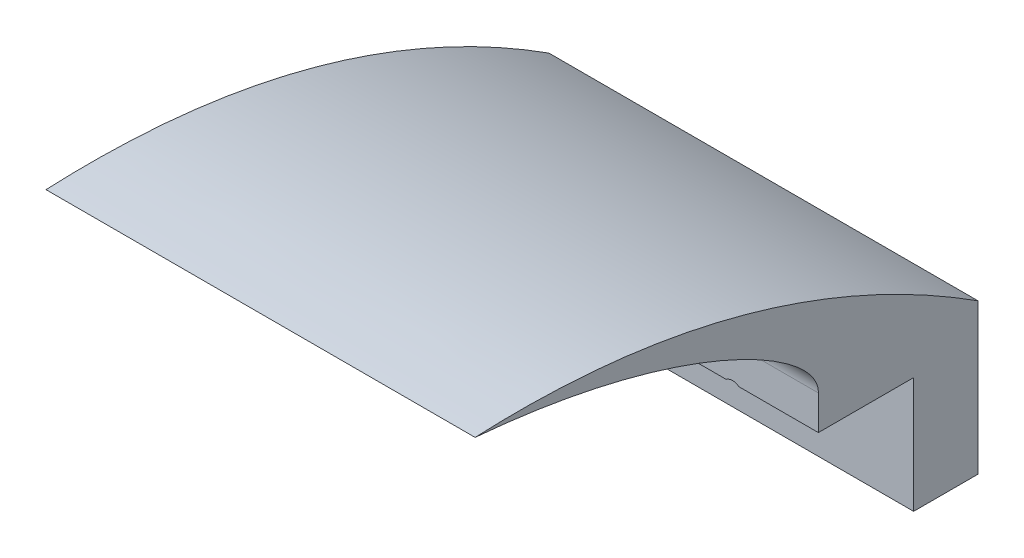
ISO-10303-21;
HEADER;
FILE_DESCRIPTION(('STEP AP214'),'2;1');
FILE_NAME('part.step','',(''),(''),'','','');
FILE_SCHEMA(('AUTOMOTIVE_DESIGN { 1 0 10303 214 1 1 1 1 }'));
ENDSEC;
DATA;
#1=APPLICATION_CONTEXT('core data for automotive mechanical design processes');
#2=APPLICATION_PROTOCOL_DEFINITION('international standard','automotive_design',2000,#1);
#3=PRODUCT_CONTEXT('',#1,'mechanical');
#4=PRODUCT('Part','Part','',(#3));
#5=PRODUCT_RELATED_PRODUCT_CATEGORY('part','',(#4));
#6=PRODUCT_DEFINITION_FORMATION('','',#4);
#7=PRODUCT_DEFINITION_CONTEXT('part definition',#1,'design');
#8=PRODUCT_DEFINITION('design','',#6,#7);
#9=PRODUCT_DEFINITION_SHAPE('','',#8);
#10=(LENGTH_UNIT() NAMED_UNIT(*) SI_UNIT(.MILLI.,.METRE.));
#11=(NAMED_UNIT(*) PLANE_ANGLE_UNIT() SI_UNIT($,.RADIAN.));
#12=(NAMED_UNIT(*) SI_UNIT($,.STERADIAN.) SOLID_ANGLE_UNIT());
#13=UNCERTAINTY_MEASURE_WITH_UNIT(LENGTH_MEASURE(1.E-05),#10,'distance_accuracy_value','');
#14=(GEOMETRIC_REPRESENTATION_CONTEXT(3) GLOBAL_UNCERTAINTY_ASSIGNED_CONTEXT((#13)) GLOBAL_UNIT_ASSIGNED_CONTEXT((#10,
#11,#12)) REPRESENTATION_CONTEXT('',''));
#15=CARTESIAN_POINT('',(0.,0.,0.));
#16=DIRECTION('',(0.,0.,1.));
#17=DIRECTION('',(1.,0.,0.));
#18=AXIS2_PLACEMENT_3D('',#15,#16,#17);
#19=CARTESIAN_POINT('',(63.5,-8.63247706217228,-29.003260664957));
#20=DIRECTION('',(0.,1.,0.));
#21=DIRECTION('',(0.,0.,1.));
#22=AXIS2_PLACEMENT_3D('',#19,#20,#21);
#23=PLANE('',#22);
#24=DIRECTION('',(-1.,0.,0.));
#25=VECTOR('',#24,1.);
#26=CARTESIAN_POINT('',(63.5,-8.63247706217228,-0.809260664956986));
#27=LINE('',#26,#25);
#28=CARTESIAN_POINT('',(63.5,-8.63247706217228,-0.809260664956986));
#29=VERTEX_POINT('',#28);
#30=CARTESIAN_POINT('',(40.005,-8.63247706217229,-0.809260664956984));
#31=VERTEX_POINT('',#30);
#32=EDGE_CURVE('E150',#29,#31,#27,.T.);
#33=ORIENTED_EDGE('',*,*,#32,.T.);
#34=DIRECTION('',(0.,0.,-1.));
#35=VECTOR('',#34,1.);
#36=CARTESIAN_POINT('',(40.005,-8.63247706217229,100.790739335043));
#37=LINE('',#36,#35);
#38=CARTESIAN_POINT('',(40.005,-8.63247706217228,-29.003260664957));
#39=VERTEX_POINT('',#38);
#40=EDGE_CURVE('E361',#31,#39,#37,.T.);
#41=ORIENTED_EDGE('',*,*,#40,.T.);
#42=DIRECTION('',(-1.,0.,0.));
#43=VECTOR('',#42,1.);
#44=CARTESIAN_POINT('',(63.5,-8.63247706217228,-29.003260664957));
#45=LINE('',#44,#43);
#46=CARTESIAN_POINT('',(63.5,-8.63247706217228,-29.003260664957));
#47=VERTEX_POINT('',#46);
#48=EDGE_CURVE('E142',#47,#39,#45,.T.);
#49=ORIENTED_EDGE('',*,*,#48,.F.);
#50=DIRECTION('',(0.,0.,-1.));
#51=VECTOR('',#50,1.);
#52=CARTESIAN_POINT('',(63.5,-8.63247706217228,-29.003260664957));
#53=LINE('',#52,#51);
#54=EDGE_CURVE('E367',#29,#47,#53,.T.);
#55=ORIENTED_EDGE('',*,*,#54,.F.);
#56=EDGE_LOOP('',(#33,#41,#49,#55));
#57=FACE_BOUND('',#56,.T.);
#58=ADVANCED_FACE('F37',(#57),#23,.F.);
#59=CARTESIAN_POINT('',(36.195,-8.63247706217228,-29.003260664957));
#60=VERTEX_POINT('',#59);
#61=CARTESIAN_POINT('',(-36.195,-8.63247706217228,-29.003260664957));
#62=VERTEX_POINT('',#61);
#63=EDGE_CURVE('E134',#60,#62,#45,.T.);
#64=ORIENTED_EDGE('',*,*,#63,.F.);
#65=DIRECTION('',(0.,0.,-1.));
#66=VECTOR('',#65,1.);
#67=CARTESIAN_POINT('',(36.195,-8.63247706217229,100.790739335043));
#68=LINE('',#67,#66);
#69=CARTESIAN_POINT('',(36.195,-8.63247706217229,-0.809260664956984));
#70=VERTEX_POINT('',#69);
#71=EDGE_CURVE('E63',#60,#70,#68,.F.);
#72=ORIENTED_EDGE('',*,*,#71,.T.);
#73=CARTESIAN_POINT('',(-36.195,-8.63247706217229,-0.809260664956984));
#74=VERTEX_POINT('',#73);
#75=EDGE_CURVE('E136',#70,#74,#27,.T.);
#76=ORIENTED_EDGE('',*,*,#75,.T.);
#77=DIRECTION('',(0.,0.,-1.));
#78=VECTOR('',#77,1.);
#79=CARTESIAN_POINT('',(-36.195,-8.63247706217229,100.790739335043));
#80=LINE('',#79,#78);
#81=EDGE_CURVE('E123',#74,#62,#80,.T.);
#82=ORIENTED_EDGE('',*,*,#81,.T.);
#83=EDGE_LOOP('',(#64,#72,#76,#82));
#84=FACE_BOUND('',#83,.T.);
#85=ADVANCED_FACE('F133',(#84),#23,.F.);
#86=CARTESIAN_POINT('',(63.5,1.52752293782772,-48.053260664957));
#87=CARTESIAN_POINT('',(63.5,44.7231521917692,19.4323343814543));
#88=CARTESIAN_POINT('',(63.5,40.9362455977717,100.790739335043));
#89=B_SPLINE_CURVE_WITH_KNOTS('',2,(#86,#87,#88),.UNSPECIFIED.,.F.,.F.,(3,3),(0.,1.),.UNSPECIFIED.);
#90=DIRECTION('',(-1.,0.,0.));
#91=VECTOR('',#90,1.);
#92=SURFACE_OF_LINEAR_EXTRUSION('',#89,#91);
#93=CARTESIAN_POINT('',(-63.5,1.52752293782772,-48.053260664957));
#94=CARTESIAN_POINT('',(-63.5,44.7231521917692,19.4323343814543));
#95=CARTESIAN_POINT('',(-63.5,40.9362455977717,100.790739335043));
#96=B_SPLINE_CURVE_WITH_KNOTS('',2,(#93,#94,#95),.UNSPECIFIED.,.F.,.F.,(3,3),(0.,1.),.UNSPECIFIED.);
#97=CARTESIAN_POINT('',(-63.5,1.52752293782772,-48.053260664957));
#98=VERTEX_POINT('',#97);
#99=CARTESIAN_POINT('',(-63.5,40.9362455977717,100.790739335043));
#100=VERTEX_POINT('',#99);
#101=EDGE_CURVE('E232',#98,#100,#96,.T.);
#102=ORIENTED_EDGE('',*,*,#101,.T.);
#103=DIRECTION('',(-1.,0.,0.));
#104=VECTOR('',#103,1.);
#105=CARTESIAN_POINT('',(63.5,40.9362455977717,100.790739335043));
#106=LINE('',#105,#104);
#107=CARTESIAN_POINT('',(63.5,40.9362455977717,100.790739335043));
#108=VERTEX_POINT('',#107);
#109=EDGE_CURVE('E11',#108,#100,#106,.T.);
#110=ORIENTED_EDGE('',*,*,#109,.F.);
#111=CARTESIAN_POINT('',(63.5,1.52752293782772,-48.053260664957));
#112=VERTEX_POINT('',#111);
#113=EDGE_CURVE('E215',#112,#108,#89,.T.);
#114=ORIENTED_EDGE('',*,*,#113,.F.);
#115=DIRECTION('',(-1.,0.,0.));
#116=VECTOR('',#115,1.);
#117=CARTESIAN_POINT('',(63.5,1.52752293782772,-48.053260664957));
#118=LINE('',#117,#116);
#119=EDGE_CURVE('E219',#112,#98,#118,.T.);
#120=ORIENTED_EDGE('',*,*,#119,.T.);
#121=EDGE_LOOP('',(#102,#110,#114,#120));
#122=FACE_BOUND('',#121,.T.);
#123=ADVANCED_FACE('F39',(#122),#92,.F.);
#124=CARTESIAN_POINT('',(63.5,40.9362455977717,100.790739335043));
#125=CARTESIAN_POINT('',(63.5,40.5065367150402,95.8120008174614));
#126=CARTESIAN_POINT('',(63.5,39.3560904800015,85.4040957347553));
#127=CARTESIAN_POINT('',(63.5,36.825372046816,70.0470492598012));
#128=CARTESIAN_POINT('',(63.5,33.4552343158838,55.2044579453297));
#129=CARTESIAN_POINT('',(63.5,29.540032244637,41.8486709281453));
#130=CARTESIAN_POINT('',(63.5,25.2554620985368,30.1358628630424));
#131=CARTESIAN_POINT('',(63.5,20.7750354323623,20.1921263411997));
#132=CARTESIAN_POINT('',(63.5,16.2715313893256,12.1116847802399));
#133=CARTESIAN_POINT('',(63.5,11.9042098812234,5.93047223723088));
#134=CARTESIAN_POINT('',(63.5,7.76806304427283,1.68165289659331));
#135=CARTESIAN_POINT('',(63.5,4.2871603037317,-0.491896356756057));
#136=CARTESIAN_POINT('',(63.5,2.16300200752415,-0.811759740084424));
#137=CARTESIAN_POINT('',(63.5,1.52752293782777,-0.809260664956984));
#138=B_SPLINE_CURVE_WITH_KNOTS('',3,(#124,#125,#126,#127,#128,#129,#130,#131,#132,#133,#134,
#135,#136,#137),.UNSPECIFIED.,.F.,.F.,(4,1,1,1,1,1,1,1,1,1,1,4),(0.353790810134737,
0.374279703233646,0.39671125377608,0.41757673414408,0.436654005915541,0.45374438973928,
0.468679993939526,0.481329415272233,0.491630702034347,0.499615788540128,0.50554628117804,
0.508115399218113),.UNSPECIFIED.);
#139=DIRECTION('',(-1.,0.,0.));
#140=VECTOR('',#139,1.);
#141=SURFACE_OF_LINEAR_EXTRUSION('',#138,#140);
#142=CARTESIAN_POINT('',(-63.5,40.9362455977717,100.790739335043));
#143=CARTESIAN_POINT('',(-63.5,40.5065367150402,95.8120008174614));
#144=CARTESIAN_POINT('',(-63.5,39.3560904800015,85.4040957347553));
#145=CARTESIAN_POINT('',(-63.5,36.825372046816,70.0470492598012));
#146=CARTESIAN_POINT('',(-63.5,33.4552343158838,55.2044579453297));
#147=CARTESIAN_POINT('',(-63.5,29.540032244637,41.8486709281453));
#148=CARTESIAN_POINT('',(-63.5,25.2554620985368,30.1358628630424));
#149=CARTESIAN_POINT('',(-63.5,20.7750354323623,20.1921263411997));
#150=CARTESIAN_POINT('',(-63.5,16.2715313893256,12.1116847802399));
#151=CARTESIAN_POINT('',(-63.5,11.9042098812234,5.93047223723088));
#152=CARTESIAN_POINT('',(-63.5,7.76806304427283,1.68165289659331));
#153=CARTESIAN_POINT('',(-63.5,4.2871603037317,-0.491896356756057));
#154=CARTESIAN_POINT('',(-63.5,2.16300200752415,-0.811759740084424));
#155=CARTESIAN_POINT('',(-63.5,1.52752293782777,-0.809260664956984));
#156=B_SPLINE_CURVE_WITH_KNOTS('',3,(#142,#143,#144,#145,#146,#147,#148,#149,#150,#151,#152,
#153,#154,#155),.UNSPECIFIED.,.F.,.F.,(4,1,1,1,1,1,1,1,1,1,1,4),(0.353790810134737,
0.374279703233646,0.39671125377608,0.41757673414408,0.436654005915541,0.45374438973928,
0.468679993939526,0.481329415272233,0.491630702034347,0.499615788540128,0.50554628117804,
0.508115399218113),.UNSPECIFIED.);
#157=CARTESIAN_POINT('',(-63.5,1.52752293782777,-0.809260664956984));
#158=VERTEX_POINT('',#157);
#159=EDGE_CURVE('E237',#100,#158,#156,.T.);
#160=ORIENTED_EDGE('',*,*,#159,.T.);
#161=DIRECTION('',(-1.,0.,0.));
#162=VECTOR('',#161,1.);
#163=CARTESIAN_POINT('',(63.5,1.52752293782777,-0.809260664956984));
#164=LINE('',#163,#162);
#165=CARTESIAN_POINT('',(63.5,1.52752293782777,-0.809260664956984));
#166=VERTEX_POINT('',#165);
#167=EDGE_CURVE('E47',#166,#158,#164,.T.);
#168=ORIENTED_EDGE('',*,*,#167,.F.);
#169=EDGE_CURVE('E255',#108,#166,#138,.T.);
#170=ORIENTED_EDGE('',*,*,#169,.F.);
#171=ORIENTED_EDGE('',*,*,#109,.T.);
#172=EDGE_LOOP('',(#160,#168,#170,#171));
#173=FACE_BOUND('',#172,.T.);
#174=ADVANCED_FACE('F191',(#173),#141,.F.);
#175=CARTESIAN_POINT('',(63.5,1.52752293782777,-0.809260664956984));
#176=DIRECTION('',(0.,0.,-1.));
#177=DIRECTION('',(0.,1.,0.));
#178=AXIS2_PLACEMENT_3D('',#175,#176,#177);
#179=PLANE('',#178);
#180=ORIENTED_EDGE('',*,*,#75,.F.);
#181=CARTESIAN_POINT('',(38.1,-11.1724770621723,-0.809260664956984));
#182=DIRECTION('',(0.,0.,-1.));
#183=DIRECTION('',(0.,1.,0.));
#184=AXIS2_PLACEMENT_3D('',#181,#182,#183);
#185=CIRCLE('',#184,3.175);
#186=EDGE_CURVE('E238',#70,#31,#185,.T.);
#187=ORIENTED_EDGE('',*,*,#186,.T.);
#188=ORIENTED_EDGE('',*,*,#32,.F.);
#189=DIRECTION('',(0.,-1.,0.));
#190=VECTOR('',#189,1.);
#191=CARTESIAN_POINT('',(63.5,1.52752293782777,-0.809260664956984));
#192=LINE('',#191,#190);
#193=EDGE_CURVE('E257',#166,#29,#192,.T.);
#194=ORIENTED_EDGE('',*,*,#193,.F.);
#195=ORIENTED_EDGE('',*,*,#167,.T.);
#196=DIRECTION('',(0.,-1.,0.));
#197=VECTOR('',#196,1.);
#198=CARTESIAN_POINT('',(-63.5,1.52752293782777,-0.809260664956984));
#199=LINE('',#198,#197);
#200=CARTESIAN_POINT('',(-63.5,-8.63247706217228,-0.809260664956986));
#201=VERTEX_POINT('',#200);
#202=EDGE_CURVE('E245',#158,#201,#199,.T.);
#203=ORIENTED_EDGE('',*,*,#202,.T.);
#204=CARTESIAN_POINT('',(-40.005,-8.63247706217229,-0.809260664956984));
#205=VERTEX_POINT('',#204);
#206=EDGE_CURVE('E145',#205,#201,#27,.T.);
#207=ORIENTED_EDGE('',*,*,#206,.F.);
#208=CARTESIAN_POINT('',(-38.1,-11.1724770621723,-0.809260664956984));
#209=DIRECTION('',(0.,0.,-1.));
#210=DIRECTION('',(0.,1.,0.));
#211=AXIS2_PLACEMENT_3D('',#208,#209,#210);
#212=CIRCLE('',#211,3.175);
#213=EDGE_CURVE('E137',#205,#74,#212,.T.);
#214=ORIENTED_EDGE('',*,*,#213,.T.);
#215=EDGE_LOOP('',(#180,#187,#188,#194,#195,#203,#207,#214));
#216=FACE_BOUND('',#215,.T.);
#217=ADVANCED_FACE('F184',(#216),#179,.F.);
#218=CARTESIAN_POINT('',(-40.005,-8.63247706217228,-29.003260664957));
#219=VERTEX_POINT('',#218);
#220=CARTESIAN_POINT('',(-63.5,-8.63247706217228,-29.003260664957));
#221=VERTEX_POINT('',#220);
#222=EDGE_CURVE('E143',#219,#221,#45,.T.);
#223=ORIENTED_EDGE('',*,*,#222,.F.);
#224=DIRECTION('',(0.,0.,-1.));
#225=VECTOR('',#224,1.);
#226=CARTESIAN_POINT('',(-40.005,-8.63247706217229,100.790739335043));
#227=LINE('',#226,#225);
#228=EDGE_CURVE('E55',#219,#205,#227,.F.);
#229=ORIENTED_EDGE('',*,*,#228,.T.);
#230=ORIENTED_EDGE('',*,*,#206,.T.);
#231=DIRECTION('',(0.,0.,-1.));
#232=VECTOR('',#231,1.);
#233=CARTESIAN_POINT('',(-63.5,-8.63247706217228,-29.003260664957));
#234=LINE('',#233,#232);
#235=EDGE_CURVE('E196',#201,#221,#234,.T.);
#236=ORIENTED_EDGE('',*,*,#235,.T.);
#237=EDGE_LOOP('',(#223,#229,#230,#236));
#238=FACE_BOUND('',#237,.T.);
#239=ADVANCED_FACE('F177',(#238),#23,.F.);
#240=CARTESIAN_POINT('',(63.5,-42.9224770621723,-29.003260664957));
#241=DIRECTION('',(0.,0.,-1.));
#242=DIRECTION('',(-1.,0.,0.));
#243=AXIS2_PLACEMENT_3D('',#240,#241,#242);
#244=PLANE('',#243);
#245=ORIENTED_EDGE('',*,*,#48,.T.);
#246=CARTESIAN_POINT('',(38.1,-11.1724770621723,-29.003260664957));
#247=DIRECTION('',(0.,0.,-1.));
#248=DIRECTION('',(-1.,0.,0.));
#249=AXIS2_PLACEMENT_3D('',#246,#247,#248);
#250=CIRCLE('',#249,3.175);
#251=EDGE_CURVE('E141',#39,#60,#250,.T.);
#252=ORIENTED_EDGE('',*,*,#251,.T.);
#253=ORIENTED_EDGE('',*,*,#63,.T.);
#254=CARTESIAN_POINT('',(-38.1,-11.1724770621723,-29.003260664957));
#255=DIRECTION('',(0.,0.,-1.));
#256=DIRECTION('',(-1.,0.,0.));
#257=AXIS2_PLACEMENT_3D('',#254,#255,#256);
#258=CIRCLE('',#257,3.175);
#259=EDGE_CURVE('E120',#62,#219,#258,.T.);
#260=ORIENTED_EDGE('',*,*,#259,.T.);
#261=ORIENTED_EDGE('',*,*,#222,.T.);
#262=DIRECTION('',(0.,-1.,0.));
#263=VECTOR('',#262,1.);
#264=CARTESIAN_POINT('',(-63.5,-42.9224770621723,-29.003260664957));
#265=LINE('',#264,#263);
#266=CARTESIAN_POINT('',(-63.5,-42.9224770621723,-29.003260664957));
#267=VERTEX_POINT('',#266);
#268=EDGE_CURVE('E199',#221,#267,#265,.T.);
#269=ORIENTED_EDGE('',*,*,#268,.T.);
#270=DIRECTION('',(-1.,0.,0.));
#271=VECTOR('',#270,1.);
#272=CARTESIAN_POINT('',(63.5,-42.9224770621723,-29.003260664957));
#273=LINE('',#272,#271);
#274=CARTESIAN_POINT('',(63.5,-42.9224770621723,-29.003260664957));
#275=VERTEX_POINT('',#274);
#276=EDGE_CURVE('E146',#275,#267,#273,.T.);
#277=ORIENTED_EDGE('',*,*,#276,.F.);
#278=DIRECTION('',(0.,-1.,0.));
#279=VECTOR('',#278,1.);
#280=CARTESIAN_POINT('',(63.5,-42.9224770621723,-29.003260664957));
#281=LINE('',#280,#279);
#282=EDGE_CURVE('E228',#47,#275,#281,.T.);
#283=ORIENTED_EDGE('',*,*,#282,.F.);
#284=EDGE_LOOP('',(#245,#252,#253,#260,#261,#269,#277,#283));
#285=FACE_BOUND('',#284,.T.);
#286=ADVANCED_FACE('F140',(#285),#244,.F.);
#287=CARTESIAN_POINT('',(63.5,-42.9224770621723,-48.053260664957));
#288=DIRECTION('',(0.,1.,0.));
#289=DIRECTION('',(0.,0.,1.));
#290=AXIS2_PLACEMENT_3D('',#287,#288,#289);
#291=PLANE('',#290);
#292=DIRECTION('',(0.,0.,-1.));
#293=VECTOR('',#292,1.);
#294=CARTESIAN_POINT('',(-63.5,-42.9224770621723,-48.053260664957));
#295=LINE('',#294,#293);
#296=CARTESIAN_POINT('',(-63.5,-42.9224770621723,-48.053260664957));
#297=VERTEX_POINT('',#296);
#298=EDGE_CURVE('E204',#267,#297,#295,.T.);
#299=ORIENTED_EDGE('',*,*,#298,.T.);
#300=DIRECTION('',(-1.,0.,0.));
#301=VECTOR('',#300,1.);
#302=CARTESIAN_POINT('',(63.5,-42.9224770621723,-48.053260664957));
#303=LINE('',#302,#301);
#304=CARTESIAN_POINT('',(63.5,-42.9224770621723,-48.053260664957));
#305=VERTEX_POINT('',#304);
#306=EDGE_CURVE('E210',#305,#297,#303,.T.);
#307=ORIENTED_EDGE('',*,*,#306,.F.);
#308=DIRECTION('',(0.,0.,-1.));
#309=VECTOR('',#308,1.);
#310=CARTESIAN_POINT('',(63.5,-42.9224770621723,-48.053260664957));
#311=LINE('',#310,#309);
#312=EDGE_CURVE('E209',#275,#305,#311,.T.);
#313=ORIENTED_EDGE('',*,*,#312,.F.);
#314=ORIENTED_EDGE('',*,*,#276,.T.);
#315=EDGE_LOOP('',(#299,#307,#313,#314));
#316=FACE_BOUND('',#315,.T.);
#317=ADVANCED_FACE('F190',(#316),#291,.F.);
#318=CARTESIAN_POINT('',(63.5,1.52752293782772,-48.053260664957));
#319=DIRECTION('',(0.,0.,1.));
#320=DIRECTION('',(1.,0.,0.));
#321=AXIS2_PLACEMENT_3D('',#318,#319,#320);
#322=PLANE('',#321);
#323=CARTESIAN_POINT('',(38.1,-11.1724770621723,-48.053260664957));
#324=DIRECTION('',(0.,0.,1.));
#325=DIRECTION('',(1.,0.,0.));
#326=AXIS2_PLACEMENT_3D('',#323,#324,#325);
#327=CIRCLE('',#326,3.175);
#328=CARTESIAN_POINT('',(41.275,-11.1724770621723,-48.053260664957));
#329=VERTEX_POINT('',#328);
#330=EDGE_CURVE('E42',#329,#329,#327,.T.);
#331=ORIENTED_EDGE('',*,*,#330,.T.);
#332=EDGE_LOOP('',(#331));
#333=FACE_BOUND('',#332,.T.);
#334=CARTESIAN_POINT('',(-38.1,-11.1724770621723,-48.053260664957));
#335=DIRECTION('',(0.,0.,1.));
#336=DIRECTION('',(1.,0.,0.));
#337=AXIS2_PLACEMENT_3D('',#334,#335,#336);
#338=CIRCLE('',#337,3.175);
#339=CARTESIAN_POINT('',(-34.925,-11.1724770621723,-48.053260664957));
#340=VERTEX_POINT('',#339);
#341=EDGE_CURVE('E128',#340,#340,#338,.T.);
#342=ORIENTED_EDGE('',*,*,#341,.T.);
#343=EDGE_LOOP('',(#342));
#344=FACE_BOUND('',#343,.T.);
#345=DIRECTION('',(0.,1.,0.));
#346=VECTOR('',#345,1.);
#347=CARTESIAN_POINT('',(-63.5,1.52752293782772,-48.053260664957));
#348=LINE('',#347,#346);
#349=EDGE_CURVE('E213',#297,#98,#348,.T.);
#350=ORIENTED_EDGE('',*,*,#349,.T.);
#351=ORIENTED_EDGE('',*,*,#119,.F.);
#352=DIRECTION('',(0.,1.,0.));
#353=VECTOR('',#352,1.);
#354=CARTESIAN_POINT('',(63.5,1.52752293782772,-48.053260664957));
#355=LINE('',#354,#353);
#356=EDGE_CURVE('E221',#305,#112,#355,.T.);
#357=ORIENTED_EDGE('',*,*,#356,.F.);
#358=ORIENTED_EDGE('',*,*,#306,.T.);
#359=EDGE_LOOP('',(#350,#351,#357,#358));
#360=FACE_BOUND('',#359,.T.);
#361=ADVANCED_FACE('F157',(#333,#344,#360),#322,.F.);
#362=CARTESIAN_POINT('',(63.5,32.9775182297844,22.9005368582487));
#363=DIRECTION('',(1.,0.,0.));
#364=DIRECTION('',(0.,0.,-1.));
#365=AXIS2_PLACEMENT_3D('',#362,#363,#364);
#366=PLANE('',#365);
#367=ORIENTED_EDGE('',*,*,#113,.T.);
#368=ORIENTED_EDGE('',*,*,#169,.T.);
#369=ORIENTED_EDGE('',*,*,#193,.T.);
#370=ORIENTED_EDGE('',*,*,#54,.T.);
#371=ORIENTED_EDGE('',*,*,#282,.T.);
#372=ORIENTED_EDGE('',*,*,#312,.T.);
#373=ORIENTED_EDGE('',*,*,#356,.T.);
#374=EDGE_LOOP('',(#367,#368,#369,#370,#371,#372,#373));
#375=FACE_BOUND('',#374,.T.);
#376=ADVANCED_FACE('F170',(#375),#366,.T.);
#377=CARTESIAN_POINT('',(-63.5,32.9775182297844,22.9005368582487));
#378=DIRECTION('',(1.,0.,0.));
#379=DIRECTION('',(0.,0.,-1.));
#380=AXIS2_PLACEMENT_3D('',#377,#378,#379);
#381=PLANE('',#380);
#382=ORIENTED_EDGE('',*,*,#101,.F.);
#383=ORIENTED_EDGE('',*,*,#349,.F.);
#384=ORIENTED_EDGE('',*,*,#298,.F.);
#385=ORIENTED_EDGE('',*,*,#268,.F.);
#386=ORIENTED_EDGE('',*,*,#235,.F.);
#387=ORIENTED_EDGE('',*,*,#202,.F.);
#388=ORIENTED_EDGE('',*,*,#159,.F.);
#389=EDGE_LOOP('',(#382,#383,#384,#385,#386,#387,#388));
#390=FACE_BOUND('',#389,.T.);
#391=ADVANCED_FACE('F162',(#390),#381,.F.);
#392=CARTESIAN_POINT('',(-38.1,-11.1724770621723,100.790739335043));
#393=DIRECTION('',(0.,0.,-1.));
#394=DIRECTION('',(-1.,0.,0.));
#395=AXIS2_PLACEMENT_3D('',#392,#393,#394);
#396=CYLINDRICAL_SURFACE('',#395,3.175);
#397=ORIENTED_EDGE('',*,*,#341,.F.);
#398=EDGE_LOOP('',(#397));
#399=FACE_BOUND('',#398,.T.);
#400=ORIENTED_EDGE('',*,*,#228,.F.);
#401=ORIENTED_EDGE('',*,*,#259,.F.);
#402=ORIENTED_EDGE('',*,*,#81,.F.);
#403=ORIENTED_EDGE('',*,*,#213,.F.);
#404=EDGE_LOOP('',(#400,#401,#402,#403));
#405=FACE_BOUND('',#404,.T.);
#406=ADVANCED_FACE('F122',(#399,#405),#396,.F.);
#407=CARTESIAN_POINT('',(38.1,-11.1724770621723,100.790739335043));
#408=DIRECTION('',(0.,0.,-1.));
#409=DIRECTION('',(-1.,0.,0.));
#410=AXIS2_PLACEMENT_3D('',#407,#408,#409);
#411=CYLINDRICAL_SURFACE('',#410,3.175);
#412=ORIENTED_EDGE('',*,*,#330,.F.);
#413=EDGE_LOOP('',(#412));
#414=FACE_BOUND('',#413,.T.);
#415=ORIENTED_EDGE('',*,*,#71,.F.);
#416=ORIENTED_EDGE('',*,*,#251,.F.);
#417=ORIENTED_EDGE('',*,*,#40,.F.);
#418=ORIENTED_EDGE('',*,*,#186,.F.);
#419=EDGE_LOOP('',(#415,#416,#417,#418));
#420=FACE_BOUND('',#419,.T.);
#421=ADVANCED_FACE('F161',(#414,#420),#411,.F.);
#422=CLOSED_SHELL('',(#58,#85,#123,#174,#217,#239,#286,#317,#361,#376,#391,#406,#421));
#423=MANIFOLD_SOLID_BREP('B2',#422);
#424=ADVANCED_BREP_SHAPE_REPRESENTATION('',(#18,#423),#14);
#425=SHAPE_DEFINITION_REPRESENTATION(#9,#424);
ENDSEC;
END-ISO-10303-21;
